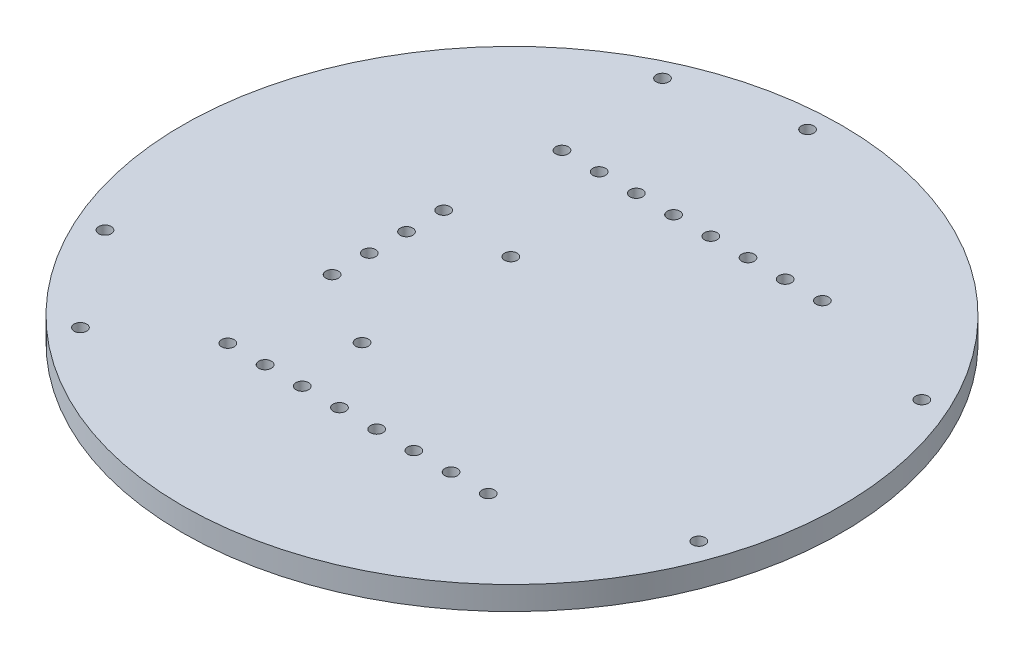
ISO-10303-21;
HEADER;
FILE_DESCRIPTION(('STEP AP214'),'2;1');
FILE_NAME('part.step','',(''),(''),'','','');
FILE_SCHEMA(('AUTOMOTIVE_DESIGN { 1 0 10303 214 1 1 1 1 }'));
ENDSEC;
DATA;
#1=APPLICATION_CONTEXT('core data for automotive mechanical design processes');
#2=APPLICATION_PROTOCOL_DEFINITION('international standard','automotive_design',2000,#1);
#3=PRODUCT_CONTEXT('',#1,'mechanical');
#4=PRODUCT('Part','Part','',(#3));
#5=PRODUCT_RELATED_PRODUCT_CATEGORY('part','',(#4));
#6=PRODUCT_DEFINITION_FORMATION('','',#4);
#7=PRODUCT_DEFINITION_CONTEXT('part definition',#1,'design');
#8=PRODUCT_DEFINITION('design','',#6,#7);
#9=PRODUCT_DEFINITION_SHAPE('','',#8);
#10=(LENGTH_UNIT() NAMED_UNIT(*) SI_UNIT(.MILLI.,.METRE.));
#11=(NAMED_UNIT(*) PLANE_ANGLE_UNIT() SI_UNIT($,.RADIAN.));
#12=(NAMED_UNIT(*) SI_UNIT($,.STERADIAN.) SOLID_ANGLE_UNIT());
#13=UNCERTAINTY_MEASURE_WITH_UNIT(LENGTH_MEASURE(1.E-05),#10,'distance_accuracy_value','');
#14=(GEOMETRIC_REPRESENTATION_CONTEXT(3) GLOBAL_UNCERTAINTY_ASSIGNED_CONTEXT((#13)) GLOBAL_UNIT_ASSIGNED_CONTEXT((#10,
#11,#12)) REPRESENTATION_CONTEXT('',''));
#15=CARTESIAN_POINT('',(0.,0.,0.));
#16=DIRECTION('',(0.,0.,1.));
#17=DIRECTION('',(1.,0.,0.));
#18=AXIS2_PLACEMENT_3D('',#15,#16,#17);
#19=CARTESIAN_POINT('',(0.,1.6,0.));
#20=DIRECTION('',(0.,-1.,0.));
#21=DIRECTION('',(0.,0.,-1.));
#22=AXIS2_PLACEMENT_3D('',#19,#20,#21);
#23=CYLINDRICAL_SURFACE('',#22,22.5);
#24=CARTESIAN_POINT('',(0.,1.6,0.));
#25=DIRECTION('',(0.,1.,0.));
#26=DIRECTION('',(0.,0.,1.));
#27=AXIS2_PLACEMENT_3D('',#24,#25,#26);
#28=CIRCLE('',#27,22.5);
#29=CARTESIAN_POINT('',(0.,1.6,22.5));
#30=VERTEX_POINT('',#29);
#31=EDGE_CURVE('E10',#30,#30,#28,.T.);
#32=ORIENTED_EDGE('',*,*,#31,.F.);
#33=EDGE_LOOP('',(#32));
#34=FACE_BOUND('',#33,.T.);
#35=CARTESIAN_POINT('',(0.,0.,0.));
#36=DIRECTION('',(0.,1.,0.));
#37=DIRECTION('',(0.,0.,1.));
#38=AXIS2_PLACEMENT_3D('',#35,#36,#37);
#39=CIRCLE('',#38,22.5);
#40=CARTESIAN_POINT('',(0.,0.,22.5));
#41=VERTEX_POINT('',#40);
#42=EDGE_CURVE('E36',#41,#41,#39,.T.);
#43=ORIENTED_EDGE('',*,*,#42,.T.);
#44=EDGE_LOOP('',(#43));
#45=FACE_BOUND('',#44,.T.);
#46=ADVANCED_FACE('F33',(#34,#45),#23,.T.);
#47=CARTESIAN_POINT('',(0.,1.6,0.));
#48=DIRECTION('',(0.,1.,0.));
#49=DIRECTION('',(0.,0.,1.));
#50=AXIS2_PLACEMENT_3D('',#47,#48,#49);
#51=PLANE('',#50);
#52=CARTESIAN_POINT('',(-2.97899464769552,1.6,-11.4699605640426));
#53=DIRECTION('',(0.,-1.,0.));
#54=DIRECTION('',(0.,0.,-1.));
#55=AXIS2_PLACEMENT_3D('',#52,#53,#54);
#56=CIRCLE('',#55,0.429187569429612);
#57=CARTESIAN_POINT('',(-2.97899464769552,1.6,-11.8991481334722));
#58=VERTEX_POINT('',#57);
#59=EDGE_CURVE('E109',#58,#58,#56,.T.);
#60=ORIENTED_EDGE('',*,*,#59,.T.);
#61=EDGE_LOOP('',(#60));
#62=FACE_BOUND('',#61,.T.);
#63=CARTESIAN_POINT('',(-5.51899464769552,1.6,-11.4699605640426));
#64=DIRECTION('',(0.,-1.,0.));
#65=DIRECTION('',(0.,0.,-1.));
#66=AXIS2_PLACEMENT_3D('',#63,#64,#65);
#67=CIRCLE('',#66,0.429187569429605);
#68=CARTESIAN_POINT('',(-5.51899464769552,1.6,-11.8991481334722));
#69=VERTEX_POINT('',#68);
#70=EDGE_CURVE('E102',#69,#69,#67,.T.);
#71=ORIENTED_EDGE('',*,*,#70,.T.);
#72=EDGE_LOOP('',(#71));
#73=FACE_BOUND('',#72,.T.);
#74=CARTESIAN_POINT('',(-8.05899464769552,1.6,-11.4699605640426));
#75=DIRECTION('',(0.,-1.,0.));
#76=DIRECTION('',(0.,0.,-1.));
#77=AXIS2_PLACEMENT_3D('',#74,#75,#76);
#78=CIRCLE('',#77,0.429187569429612);
#79=CARTESIAN_POINT('',(-8.05899464769552,1.6,-11.8991481334722));
#80=VERTEX_POINT('',#79);
#81=EDGE_CURVE('E103',#80,#80,#78,.T.);
#82=ORIENTED_EDGE('',*,*,#81,.T.);
#83=EDGE_LOOP('',(#82));
#84=FACE_BOUND('',#83,.T.);
#85=CARTESIAN_POINT('',(-3.51378517532097,1.6,6.72628011951915));
#86=DIRECTION('',(0.,-1.,0.));
#87=DIRECTION('',(0.,0.,-1.));
#88=AXIS2_PLACEMENT_3D('',#85,#86,#87);
#89=CIRCLE('',#88,0.429187569429612);
#90=CARTESIAN_POINT('',(-3.51378517532097,1.6,6.29709255008953));
#91=VERTEX_POINT('',#90);
#92=EDGE_CURVE('E116',#91,#91,#89,.T.);
#93=ORIENTED_EDGE('',*,*,#92,.T.);
#94=EDGE_LOOP('',(#93));
#95=FACE_BOUND('',#94,.T.);
#96=CARTESIAN_POINT('',(-0.438994647695517,1.6,-11.4699605640425));
#97=DIRECTION('',(0.,-1.,0.));
#98=DIRECTION('',(0.,0.,-1.));
#99=AXIS2_PLACEMENT_3D('',#96,#97,#98);
#100=CIRCLE('',#99,0.429187569429612);
#101=CARTESIAN_POINT('',(-0.438994647695517,1.6,-11.8991481334722));
#102=VERTEX_POINT('',#101);
#103=EDGE_CURVE('E127',#102,#102,#100,.T.);
#104=ORIENTED_EDGE('',*,*,#103,.T.);
#105=EDGE_LOOP('',(#104));
#106=FACE_BOUND('',#105,.T.);
#107=CARTESIAN_POINT('',(2.10100535230448,1.6,-11.4699605640425));
#108=DIRECTION('',(0.,-1.,0.));
#109=DIRECTION('',(0.,0.,-1.));
#110=AXIS2_PLACEMENT_3D('',#107,#108,#109);
#111=CIRCLE('',#110,0.429187569429612);
#112=CARTESIAN_POINT('',(2.10100535230448,1.6,-11.8991481334721));
#113=VERTEX_POINT('',#112);
#114=EDGE_CURVE('E133',#113,#113,#111,.T.);
#115=ORIENTED_EDGE('',*,*,#114,.T.);
#116=EDGE_LOOP('',(#115));
#117=FACE_BOUND('',#116,.T.);
#118=CARTESIAN_POINT('',(4.64100535230448,1.6,-11.4699605640425));
#119=DIRECTION('',(0.,-1.,0.));
#120=DIRECTION('',(0.,0.,-1.));
#121=AXIS2_PLACEMENT_3D('',#118,#119,#120);
#122=CIRCLE('',#121,0.429187569429612);
#123=CARTESIAN_POINT('',(4.64100535230448,1.6,-11.8991481334721));
#124=VERTEX_POINT('',#123);
#125=EDGE_CURVE('E139',#124,#124,#122,.T.);
#126=ORIENTED_EDGE('',*,*,#125,.T.);
#127=EDGE_LOOP('',(#126));
#128=FACE_BOUND('',#127,.T.);
#129=CARTESIAN_POINT('',(7.18100535230448,1.6,-11.4699605640425));
#130=DIRECTION('',(0.,-1.,0.));
#131=DIRECTION('',(0.,0.,-1.));
#132=AXIS2_PLACEMENT_3D('',#129,#130,#131);
#133=CIRCLE('',#132,0.429187569429605);
#134=CARTESIAN_POINT('',(7.18100535230448,1.6,-11.8991481334721));
#135=VERTEX_POINT('',#134);
#136=EDGE_CURVE('E91',#135,#135,#133,.T.);
#137=ORIENTED_EDGE('',*,*,#136,.T.);
#138=EDGE_LOOP('',(#137));
#139=FACE_BOUND('',#138,.T.);
#140=CARTESIAN_POINT('',(7.18100535230449,1.6,11.3405589401693));
#141=DIRECTION('',(0.,-1.,0.));
#142=DIRECTION('',(0.,0.,-1.));
#143=AXIS2_PLACEMENT_3D('',#140,#141,#142);
#144=CIRCLE('',#143,0.42918756942961);
#145=CARTESIAN_POINT('',(7.18100535230449,1.6,10.9113713707397));
#146=VERTEX_POINT('',#145);
#147=EDGE_CURVE('E48',#146,#146,#144,.T.);
#148=ORIENTED_EDGE('',*,*,#147,.T.);
#149=EDGE_LOOP('',(#148));
#150=FACE_BOUND('',#149,.T.);
#151=CARTESIAN_POINT('',(4.64100535230448,1.6,11.3405589401693));
#152=DIRECTION('',(0.,-1.,0.));
#153=DIRECTION('',(0.,0.,-1.));
#154=AXIS2_PLACEMENT_3D('',#151,#152,#153);
#155=CIRCLE('',#154,0.42918756942961);
#156=CARTESIAN_POINT('',(4.64100535230448,1.6,10.9113713707397));
#157=VERTEX_POINT('',#156);
#158=EDGE_CURVE('E67',#157,#157,#155,.T.);
#159=ORIENTED_EDGE('',*,*,#158,.T.);
#160=EDGE_LOOP('',(#159));
#161=FACE_BOUND('',#160,.T.);
#162=CARTESIAN_POINT('',(2.10100535230449,1.6,11.3405589401693));
#163=DIRECTION('',(0.,-1.,0.));
#164=DIRECTION('',(0.,0.,-1.));
#165=AXIS2_PLACEMENT_3D('',#162,#163,#164);
#166=CIRCLE('',#165,0.42918756942961);
#167=CARTESIAN_POINT('',(2.10100535230449,1.6,10.9113713707397));
#168=VERTEX_POINT('',#167);
#169=EDGE_CURVE('E61',#168,#168,#166,.T.);
#170=ORIENTED_EDGE('',*,*,#169,.T.);
#171=EDGE_LOOP('',(#170));
#172=FACE_BOUND('',#171,.T.);
#173=CARTESIAN_POINT('',(-0.438994647695515,1.6,11.3405589401693));
#174=DIRECTION('',(0.,-1.,0.));
#175=DIRECTION('',(0.,0.,-1.));
#176=AXIS2_PLACEMENT_3D('',#173,#174,#175);
#177=CIRCLE('',#176,0.42918756942961);
#178=CARTESIAN_POINT('',(-0.438994647695515,1.6,10.9113713707396));
#179=VERTEX_POINT('',#178);
#180=EDGE_CURVE('E54',#179,#179,#177,.T.);
#181=ORIENTED_EDGE('',*,*,#180,.T.);
#182=EDGE_LOOP('',(#181));
#183=FACE_BOUND('',#182,.T.);
#184=CARTESIAN_POINT('',(9.72100535230449,1.6,-11.4699605640425));
#185=DIRECTION('',(0.,-1.,0.));
#186=DIRECTION('',(0.,0.,-1.));
#187=AXIS2_PLACEMENT_3D('',#184,#185,#186);
#188=CIRCLE('',#187,0.429187569429612);
#189=CARTESIAN_POINT('',(9.72100535230449,1.6,-11.8991481334721));
#190=VERTEX_POINT('',#189);
#191=EDGE_CURVE('E90',#190,#190,#188,.T.);
#192=ORIENTED_EDGE('',*,*,#191,.T.);
#193=EDGE_LOOP('',(#192));
#194=FACE_BOUND('',#193,.T.);
#195=CARTESIAN_POINT('',(-8.05899464769552,1.6,11.3405589401692));
#196=DIRECTION('',(0.,-1.,0.));
#197=DIRECTION('',(0.,0.,-1.));
#198=AXIS2_PLACEMENT_3D('',#195,#196,#197);
#199=CIRCLE('',#198,0.42918756942961);
#200=CARTESIAN_POINT('',(-8.05899464769552,1.6,10.9113713707396));
#201=VERTEX_POINT('',#200);
#202=EDGE_CURVE('E79',#201,#201,#199,.T.);
#203=ORIENTED_EDGE('',*,*,#202,.T.);
#204=EDGE_LOOP('',(#203));
#205=FACE_BOUND('',#204,.T.);
#206=CARTESIAN_POINT('',(-5.51899464769551,1.6,11.3405589401692));
#207=DIRECTION('',(0.,-1.,0.));
#208=DIRECTION('',(0.,0.,-1.));
#209=AXIS2_PLACEMENT_3D('',#206,#207,#208);
#210=CIRCLE('',#209,0.42918756942961);
#211=CARTESIAN_POINT('',(-5.51899464769551,1.6,10.9113713707396));
#212=VERTEX_POINT('',#211);
#213=EDGE_CURVE('E78',#212,#212,#210,.T.);
#214=ORIENTED_EDGE('',*,*,#213,.T.);
#215=EDGE_LOOP('',(#214));
#216=FACE_BOUND('',#215,.T.);
#217=CARTESIAN_POINT('',(-2.97899464769552,1.6,11.3405589401692));
#218=DIRECTION('',(0.,-1.,0.));
#219=DIRECTION('',(0.,0.,-1.));
#220=AXIS2_PLACEMENT_3D('',#217,#218,#219);
#221=CIRCLE('',#220,0.42918756942961);
#222=CARTESIAN_POINT('',(-2.97899464769552,1.6,10.9113713707396));
#223=VERTEX_POINT('',#222);
#224=EDGE_CURVE('E55',#223,#223,#221,.T.);
#225=ORIENTED_EDGE('',*,*,#224,.T.);
#226=EDGE_LOOP('',(#225));
#227=FACE_BOUND('',#226,.T.);
#228=CARTESIAN_POINT('',(-8.88414423790684,1.6,-19.1580461894958));
#229=DIRECTION('',(0.,-1.,0.));
#230=DIRECTION('',(0.,0.,-1.));
#231=AXIS2_PLACEMENT_3D('',#228,#229,#230);
#232=CIRCLE('',#231,0.429187569429612);
#233=CARTESIAN_POINT('',(-8.88414423790684,1.6,-19.5872337589254));
#234=VERTEX_POINT('',#233);
#235=EDGE_CURVE('E192',#234,#234,#232,.T.);
#236=ORIENTED_EDGE('',*,*,#235,.T.);
#237=EDGE_LOOP('',(#236));
#238=FACE_BOUND('',#237,.T.);
#239=CARTESIAN_POINT('',(-3.51378517532097,1.6,-3.4365775709162));
#240=DIRECTION('',(0.,-1.,0.));
#241=DIRECTION('',(0.,0.,-1.));
#242=AXIS2_PLACEMENT_3D('',#239,#240,#241);
#243=CIRCLE('',#242,0.429187569429612);
#244=CARTESIAN_POINT('',(-3.51378517532097,1.6,-3.86576514034581));
#245=VERTEX_POINT('',#244);
#246=EDGE_CURVE('E198',#245,#245,#243,.T.);
#247=ORIENTED_EDGE('',*,*,#246,.T.);
#248=EDGE_LOOP('',(#247));
#249=FACE_BOUND('',#248,.T.);
#250=CARTESIAN_POINT('',(-18.9407008940795,1.6,8.84754938333288));
#251=DIRECTION('',(0.,-1.,0.));
#252=DIRECTION('',(0.,0.,-1.));
#253=AXIS2_PLACEMENT_3D('',#250,#251,#252);
#254=CIRCLE('',#253,0.429187569429612);
#255=CARTESIAN_POINT('',(-18.9407008940795,1.6,8.41836181390326));
#256=VERTEX_POINT('',#255);
#257=EDGE_CURVE('E204',#256,#256,#254,.T.);
#258=ORIENTED_EDGE('',*,*,#257,.T.);
#259=EDGE_LOOP('',(#258));
#260=FACE_BOUND('',#259,.T.);
#261=CARTESIAN_POINT('',(-14.0138656520684,1.6,15.4510772660608));
#262=DIRECTION('',(0.,-1.,0.));
#263=DIRECTION('',(0.,0.,-1.));
#264=AXIS2_PLACEMENT_3D('',#261,#262,#263);
#265=CIRCLE('',#264,0.429187569429612);
#266=CARTESIAN_POINT('',(-14.0138656520684,1.6,15.0218896966312));
#267=VERTEX_POINT('',#266);
#268=EDGE_CURVE('E170',#267,#267,#265,.T.);
#269=ORIENTED_EDGE('',*,*,#268,.T.);
#270=EDGE_LOOP('',(#269));
#271=FACE_BOUND('',#270,.T.);
#272=CARTESIAN_POINT('',(-8.55485081393295,1.6,-3.89168443572245));
#273=DIRECTION('',(0.,-1.,0.));
#274=DIRECTION('',(0.,0.,-1.));
#275=AXIS2_PLACEMENT_3D('',#272,#273,#274);
#276=CIRCLE('',#275,0.429187569429612);
#277=CARTESIAN_POINT('',(-8.55485081393295,1.6,-4.32087200515206));
#278=VERTEX_POINT('',#277);
#279=EDGE_CURVE('E169',#278,#278,#276,.T.);
#280=ORIENTED_EDGE('',*,*,#279,.T.);
#281=EDGE_LOOP('',(#280));
#282=FACE_BOUND('',#281,.T.);
#283=CARTESIAN_POINT('',(-8.55485081393298,1.6,-1.35168443572245));
#284=DIRECTION('',(0.,-1.,0.));
#285=DIRECTION('',(0.,0.,-1.));
#286=AXIS2_PLACEMENT_3D('',#283,#284,#285);
#287=CIRCLE('',#286,0.429187569429612);
#288=CARTESIAN_POINT('',(-8.55485081393298,1.6,-1.78087200515206));
#289=VERTEX_POINT('',#288);
#290=EDGE_CURVE('E176',#289,#289,#287,.T.);
#291=ORIENTED_EDGE('',*,*,#290,.T.);
#292=EDGE_LOOP('',(#291));
#293=FACE_BOUND('',#292,.T.);
#294=CARTESIAN_POINT('',(-8.55485081393301,1.6,1.18831556427755));
#295=DIRECTION('',(0.,-1.,0.));
#296=DIRECTION('',(0.,0.,-1.));
#297=AXIS2_PLACEMENT_3D('',#294,#295,#296);
#298=CIRCLE('',#297,0.429187569429612);
#299=CARTESIAN_POINT('',(-8.55485081393301,1.6,0.759127994847939));
#300=VERTEX_POINT('',#299);
#301=EDGE_CURVE('E182',#300,#300,#298,.T.);
#302=ORIENTED_EDGE('',*,*,#301,.T.);
#303=EDGE_LOOP('',(#302));
#304=FACE_BOUND('',#303,.T.);
#305=CARTESIAN_POINT('',(-8.55485081393303,1.6,3.72831556427755));
#306=DIRECTION('',(0.,-1.,0.));
#307=DIRECTION('',(0.,0.,-1.));
#308=AXIS2_PLACEMENT_3D('',#305,#306,#307);
#309=CIRCLE('',#308,0.429187569429612);
#310=CARTESIAN_POINT('',(-8.55485081393303,1.6,3.29912799484794));
#311=VERTEX_POINT('',#310);
#312=EDGE_CURVE('E117',#311,#311,#309,.T.);
#313=ORIENTED_EDGE('',*,*,#312,.T.);
#314=EDGE_LOOP('',(#313));
#315=FACE_BOUND('',#314,.T.);
#316=CARTESIAN_POINT('',(18.9717831853835,1.6,-9.00947234491412));
#317=DIRECTION('',(0.,-1.,0.));
#318=DIRECTION('',(0.,0.,-1.));
#319=AXIS2_PLACEMENT_3D('',#316,#317,#318);
#320=CIRCLE('',#319,0.429187569429612);
#321=CARTESIAN_POINT('',(18.9717831853835,1.6,-9.43865991434373));
#322=VERTEX_POINT('',#321);
#323=EDGE_CURVE('E151',#322,#322,#320,.T.);
#324=ORIENTED_EDGE('',*,*,#323,.T.);
#325=EDGE_LOOP('',(#324));
#326=FACE_BOUND('',#325,.T.);
#327=CARTESIAN_POINT('',(19.7228158943386,1.6,6.97046417118941));
#328=DIRECTION('',(0.,-1.,0.));
#329=DIRECTION('',(0.,0.,-1.));
#330=AXIS2_PLACEMENT_3D('',#327,#328,#329);
#331=CIRCLE('',#330,0.429187569429612);
#332=CARTESIAN_POINT('',(19.7228158943386,1.6,6.54127660175979));
#333=VERTEX_POINT('',#332);
#334=EDGE_CURVE('E150',#333,#333,#331,.T.);
#335=ORIENTED_EDGE('',*,*,#334,.T.);
#336=EDGE_LOOP('',(#335));
#337=FACE_BOUND('',#336,.T.);
#338=CARTESIAN_POINT('',(-0.906931183922655,1.6,-21.088850712065));
#339=DIRECTION('',(0.,-1.,0.));
#340=DIRECTION('',(0.,0.,-1.));
#341=AXIS2_PLACEMENT_3D('',#338,#339,#340);
#342=CIRCLE('',#341,0.429187569429612);
#343=CARTESIAN_POINT('',(-0.906931183922655,1.6,-21.5180382814946));
#344=VERTEX_POINT('',#343);
#345=EDGE_CURVE('E157',#344,#344,#342,.T.);
#346=ORIENTED_EDGE('',*,*,#345,.T.);
#347=EDGE_LOOP('',(#346));
#348=FACE_BOUND('',#347,.T.);
#349=CARTESIAN_POINT('',(9.72100535230449,1.6,11.3405589401693));
#350=DIRECTION('',(0.,-1.,0.));
#351=DIRECTION('',(0.,0.,-1.));
#352=AXIS2_PLACEMENT_3D('',#349,#350,#351);
#353=CIRCLE('',#352,0.42918756942961);
#354=CARTESIAN_POINT('',(9.72100535230449,1.6,10.9113713707397));
#355=VERTEX_POINT('',#354);
#356=EDGE_CURVE('E43',#355,#355,#353,.T.);
#357=ORIENTED_EDGE('',*,*,#356,.T.);
#358=EDGE_LOOP('',(#357));
#359=FACE_BOUND('',#358,.T.);
#360=ORIENTED_EDGE('',*,*,#31,.T.);
#361=EDGE_LOOP('',(#360));
#362=FACE_BOUND('',#361,.T.);
#363=ADVANCED_FACE('F213',(#62,#73,#84,#95,#106,#117,#128,#139,#150,#161,#172,#183,#194,#205,
#216,#227,#238,#249,#260,#271,#282,#293,#304,#315,#326,#337,#348,#359,#362),#51,.T.);
#364=CARTESIAN_POINT('',(0.,0.,0.));
#365=DIRECTION('',(0.,1.,0.));
#366=DIRECTION('',(0.,0.,1.));
#367=AXIS2_PLACEMENT_3D('',#364,#365,#366);
#368=PLANE('',#367);
#369=CARTESIAN_POINT('',(-2.97899464769552,0.,-11.4699605640426));
#370=DIRECTION('',(0.,-1.,0.));
#371=DIRECTION('',(0.,0.,-1.));
#372=AXIS2_PLACEMENT_3D('',#369,#370,#371);
#373=CIRCLE('',#372,0.429187569429612);
#374=CARTESIAN_POINT('',(-2.97899464769552,0.,-11.8991481334722));
#375=VERTEX_POINT('',#374);
#376=EDGE_CURVE('E106',#375,#375,#373,.T.);
#377=ORIENTED_EDGE('',*,*,#376,.F.);
#378=EDGE_LOOP('',(#377));
#379=FACE_BOUND('',#378,.T.);
#380=CARTESIAN_POINT('',(-5.51899464769552,0.,-11.4699605640426));
#381=DIRECTION('',(0.,-1.,0.));
#382=DIRECTION('',(0.,0.,-1.));
#383=AXIS2_PLACEMENT_3D('',#380,#381,#382);
#384=CIRCLE('',#383,0.429187569429605);
#385=CARTESIAN_POINT('',(-5.51899464769552,0.,-11.8991481334722));
#386=VERTEX_POINT('',#385);
#387=EDGE_CURVE('E99',#386,#386,#384,.T.);
#388=ORIENTED_EDGE('',*,*,#387,.F.);
#389=EDGE_LOOP('',(#388));
#390=FACE_BOUND('',#389,.T.);
#391=CARTESIAN_POINT('',(-8.05899464769552,0.,-11.4699605640426));
#392=DIRECTION('',(0.,-1.,0.));
#393=DIRECTION('',(0.,0.,-1.));
#394=AXIS2_PLACEMENT_3D('',#391,#392,#393);
#395=CIRCLE('',#394,0.429187569429612);
#396=CARTESIAN_POINT('',(-8.05899464769552,0.,-11.8991481334722));
#397=VERTEX_POINT('',#396);
#398=EDGE_CURVE('E120',#397,#397,#395,.T.);
#399=ORIENTED_EDGE('',*,*,#398,.F.);
#400=EDGE_LOOP('',(#399));
#401=FACE_BOUND('',#400,.T.);
#402=CARTESIAN_POINT('',(-3.51378517532097,0.,6.72628011951915));
#403=DIRECTION('',(0.,-1.,0.));
#404=DIRECTION('',(0.,0.,-1.));
#405=AXIS2_PLACEMENT_3D('',#402,#403,#404);
#406=CIRCLE('',#405,0.429187569429612);
#407=CARTESIAN_POINT('',(-3.51378517532097,0.,6.29709255008953));
#408=VERTEX_POINT('',#407);
#409=EDGE_CURVE('E113',#408,#408,#406,.T.);
#410=ORIENTED_EDGE('',*,*,#409,.F.);
#411=EDGE_LOOP('',(#410));
#412=FACE_BOUND('',#411,.T.);
#413=CARTESIAN_POINT('',(-0.438994647695517,0.,-11.4699605640425));
#414=DIRECTION('',(0.,-1.,0.));
#415=DIRECTION('',(0.,0.,-1.));
#416=AXIS2_PLACEMENT_3D('',#413,#414,#415);
#417=CIRCLE('',#416,0.429187569429612);
#418=CARTESIAN_POINT('',(-0.438994647695517,0.,-11.8991481334722));
#419=VERTEX_POINT('',#418);
#420=EDGE_CURVE('E112',#419,#419,#417,.T.);
#421=ORIENTED_EDGE('',*,*,#420,.F.);
#422=EDGE_LOOP('',(#421));
#423=FACE_BOUND('',#422,.T.);
#424=CARTESIAN_POINT('',(2.10100535230448,0.,-11.4699605640425));
#425=DIRECTION('',(0.,-1.,0.));
#426=DIRECTION('',(0.,0.,-1.));
#427=AXIS2_PLACEMENT_3D('',#424,#425,#426);
#428=CIRCLE('',#427,0.429187569429612);
#429=CARTESIAN_POINT('',(2.10100535230448,0.,-11.8991481334721));
#430=VERTEX_POINT('',#429);
#431=EDGE_CURVE('E130',#430,#430,#428,.T.);
#432=ORIENTED_EDGE('',*,*,#431,.F.);
#433=EDGE_LOOP('',(#432));
#434=FACE_BOUND('',#433,.T.);
#435=CARTESIAN_POINT('',(4.64100535230448,0.,-11.4699605640425));
#436=DIRECTION('',(0.,-1.,0.));
#437=DIRECTION('',(0.,0.,-1.));
#438=AXIS2_PLACEMENT_3D('',#435,#436,#437);
#439=CIRCLE('',#438,0.429187569429612);
#440=CARTESIAN_POINT('',(4.64100535230448,0.,-11.8991481334721));
#441=VERTEX_POINT('',#440);
#442=EDGE_CURVE('E136',#441,#441,#439,.T.);
#443=ORIENTED_EDGE('',*,*,#442,.F.);
#444=EDGE_LOOP('',(#443));
#445=FACE_BOUND('',#444,.T.);
#446=CARTESIAN_POINT('',(7.18100535230448,0.,-11.4699605640425));
#447=DIRECTION('',(0.,-1.,0.));
#448=DIRECTION('',(0.,0.,-1.));
#449=AXIS2_PLACEMENT_3D('',#446,#447,#448);
#450=CIRCLE('',#449,0.429187569429605);
#451=CARTESIAN_POINT('',(7.18100535230448,0.,-11.8991481334721));
#452=VERTEX_POINT('',#451);
#453=EDGE_CURVE('E142',#452,#452,#450,.T.);
#454=ORIENTED_EDGE('',*,*,#453,.F.);
#455=EDGE_LOOP('',(#454));
#456=FACE_BOUND('',#455,.T.);
#457=CARTESIAN_POINT('',(7.18100535230449,0.,11.3405589401693));
#458=DIRECTION('',(0.,-1.,0.));
#459=DIRECTION('',(0.,0.,-1.));
#460=AXIS2_PLACEMENT_3D('',#457,#458,#459);
#461=CIRCLE('',#460,0.42918756942961);
#462=CARTESIAN_POINT('',(7.18100535230449,0.,10.9113713707397));
#463=VERTEX_POINT('',#462);
#464=EDGE_CURVE('E70',#463,#463,#461,.T.);
#465=ORIENTED_EDGE('',*,*,#464,.F.);
#466=EDGE_LOOP('',(#465));
#467=FACE_BOUND('',#466,.T.);
#468=CARTESIAN_POINT('',(4.64100535230448,0.,11.3405589401693));
#469=DIRECTION('',(0.,-1.,0.));
#470=DIRECTION('',(0.,0.,-1.));
#471=AXIS2_PLACEMENT_3D('',#468,#469,#470);
#472=CIRCLE('',#471,0.42918756942961);
#473=CARTESIAN_POINT('',(4.64100535230448,0.,10.9113713707397));
#474=VERTEX_POINT('',#473);
#475=EDGE_CURVE('E64',#474,#474,#472,.T.);
#476=ORIENTED_EDGE('',*,*,#475,.F.);
#477=EDGE_LOOP('',(#476));
#478=FACE_BOUND('',#477,.T.);
#479=CARTESIAN_POINT('',(2.10100535230449,0.,11.3405589401693));
#480=DIRECTION('',(0.,-1.,0.));
#481=DIRECTION('',(0.,0.,-1.));
#482=AXIS2_PLACEMENT_3D('',#479,#480,#481);
#483=CIRCLE('',#482,0.42918756942961);
#484=CARTESIAN_POINT('',(2.10100535230449,0.,10.9113713707397));
#485=VERTEX_POINT('',#484);
#486=EDGE_CURVE('E58',#485,#485,#483,.T.);
#487=ORIENTED_EDGE('',*,*,#486,.F.);
#488=EDGE_LOOP('',(#487));
#489=FACE_BOUND('',#488,.T.);
#490=CARTESIAN_POINT('',(-0.438994647695515,0.,11.3405589401693));
#491=DIRECTION('',(0.,-1.,0.));
#492=DIRECTION('',(0.,0.,-1.));
#493=AXIS2_PLACEMENT_3D('',#490,#491,#492);
#494=CIRCLE('',#493,0.42918756942961);
#495=CARTESIAN_POINT('',(-0.438994647695515,0.,10.9113713707396));
#496=VERTEX_POINT('',#495);
#497=EDGE_CURVE('E51',#496,#496,#494,.T.);
#498=ORIENTED_EDGE('',*,*,#497,.F.);
#499=EDGE_LOOP('',(#498));
#500=FACE_BOUND('',#499,.T.);
#501=CARTESIAN_POINT('',(9.72100535230449,0.,-11.4699605640425));
#502=DIRECTION('',(0.,-1.,0.));
#503=DIRECTION('',(0.,0.,-1.));
#504=AXIS2_PLACEMENT_3D('',#501,#502,#503);
#505=CIRCLE('',#504,0.429187569429612);
#506=CARTESIAN_POINT('',(9.72100535230449,0.,-11.8991481334721));
#507=VERTEX_POINT('',#506);
#508=EDGE_CURVE('E87',#507,#507,#505,.T.);
#509=ORIENTED_EDGE('',*,*,#508,.F.);
#510=EDGE_LOOP('',(#509));
#511=FACE_BOUND('',#510,.T.);
#512=CARTESIAN_POINT('',(-8.05899464769552,0.,11.3405589401692));
#513=DIRECTION('',(0.,-1.,0.));
#514=DIRECTION('',(0.,0.,-1.));
#515=AXIS2_PLACEMENT_3D('',#512,#513,#514);
#516=CIRCLE('',#515,0.42918756942961);
#517=CARTESIAN_POINT('',(-8.05899464769552,0.,10.9113713707396));
#518=VERTEX_POINT('',#517);
#519=EDGE_CURVE('E94',#518,#518,#516,.T.);
#520=ORIENTED_EDGE('',*,*,#519,.F.);
#521=EDGE_LOOP('',(#520));
#522=FACE_BOUND('',#521,.T.);
#523=CARTESIAN_POINT('',(-5.51899464769551,0.,11.3405589401692));
#524=DIRECTION('',(0.,-1.,0.));
#525=DIRECTION('',(0.,0.,-1.));
#526=AXIS2_PLACEMENT_3D('',#523,#524,#525);
#527=CIRCLE('',#526,0.42918756942961);
#528=CARTESIAN_POINT('',(-5.51899464769551,0.,10.9113713707396));
#529=VERTEX_POINT('',#528);
#530=EDGE_CURVE('E75',#529,#529,#527,.T.);
#531=ORIENTED_EDGE('',*,*,#530,.F.);
#532=EDGE_LOOP('',(#531));
#533=FACE_BOUND('',#532,.T.);
#534=CARTESIAN_POINT('',(-2.97899464769552,0.,11.3405589401692));
#535=DIRECTION('',(0.,-1.,0.));
#536=DIRECTION('',(0.,0.,-1.));
#537=AXIS2_PLACEMENT_3D('',#534,#535,#536);
#538=CIRCLE('',#537,0.42918756942961);
#539=CARTESIAN_POINT('',(-2.97899464769552,0.,10.9113713707396));
#540=VERTEX_POINT('',#539);
#541=EDGE_CURVE('E82',#540,#540,#538,.T.);
#542=ORIENTED_EDGE('',*,*,#541,.F.);
#543=EDGE_LOOP('',(#542));
#544=FACE_BOUND('',#543,.T.);
#545=CARTESIAN_POINT('',(-8.88414423790684,0.,-19.1580461894958));
#546=DIRECTION('',(0.,-1.,0.));
#547=DIRECTION('',(0.,0.,-1.));
#548=AXIS2_PLACEMENT_3D('',#545,#546,#547);
#549=CIRCLE('',#548,0.429187569429612);
#550=CARTESIAN_POINT('',(-8.88414423790684,0.,-19.5872337589254));
#551=VERTEX_POINT('',#550);
#552=EDGE_CURVE('E160',#551,#551,#549,.T.);
#553=ORIENTED_EDGE('',*,*,#552,.F.);
#554=EDGE_LOOP('',(#553));
#555=FACE_BOUND('',#554,.T.);
#556=CARTESIAN_POINT('',(-3.51378517532097,0.,-3.4365775709162));
#557=DIRECTION('',(0.,-1.,0.));
#558=DIRECTION('',(0.,0.,-1.));
#559=AXIS2_PLACEMENT_3D('',#556,#557,#558);
#560=CIRCLE('',#559,0.429187569429612);
#561=CARTESIAN_POINT('',(-3.51378517532097,0.,-3.86576514034581));
#562=VERTEX_POINT('',#561);
#563=EDGE_CURVE('E195',#562,#562,#560,.T.);
#564=ORIENTED_EDGE('',*,*,#563,.F.);
#565=EDGE_LOOP('',(#564));
#566=FACE_BOUND('',#565,.T.);
#567=CARTESIAN_POINT('',(-18.9407008940795,0.,8.84754938333288));
#568=DIRECTION('',(0.,-1.,0.));
#569=DIRECTION('',(0.,0.,-1.));
#570=AXIS2_PLACEMENT_3D('',#567,#568,#569);
#571=CIRCLE('',#570,0.429187569429612);
#572=CARTESIAN_POINT('',(-18.9407008940795,0.,8.41836181390326));
#573=VERTEX_POINT('',#572);
#574=EDGE_CURVE('E201',#573,#573,#571,.T.);
#575=ORIENTED_EDGE('',*,*,#574,.F.);
#576=EDGE_LOOP('',(#575));
#577=FACE_BOUND('',#576,.T.);
#578=CARTESIAN_POINT('',(-14.0138656520684,0.,15.4510772660608));
#579=DIRECTION('',(0.,-1.,0.));
#580=DIRECTION('',(0.,0.,-1.));
#581=AXIS2_PLACEMENT_3D('',#578,#579,#580);
#582=CIRCLE('',#581,0.429187569429612);
#583=CARTESIAN_POINT('',(-14.0138656520684,0.,15.0218896966312));
#584=VERTEX_POINT('',#583);
#585=EDGE_CURVE('E207',#584,#584,#582,.T.);
#586=ORIENTED_EDGE('',*,*,#585,.F.);
#587=EDGE_LOOP('',(#586));
#588=FACE_BOUND('',#587,.T.);
#589=CARTESIAN_POINT('',(-8.55485081393295,0.,-3.89168443572245));
#590=DIRECTION('',(0.,-1.,0.));
#591=DIRECTION('',(0.,0.,-1.));
#592=AXIS2_PLACEMENT_3D('',#589,#590,#591);
#593=CIRCLE('',#592,0.429187569429612);
#594=CARTESIAN_POINT('',(-8.55485081393295,0.,-4.32087200515206));
#595=VERTEX_POINT('',#594);
#596=EDGE_CURVE('E166',#595,#595,#593,.T.);
#597=ORIENTED_EDGE('',*,*,#596,.F.);
#598=EDGE_LOOP('',(#597));
#599=FACE_BOUND('',#598,.T.);
#600=CARTESIAN_POINT('',(-8.55485081393298,0.,-1.35168443572245));
#601=DIRECTION('',(0.,-1.,0.));
#602=DIRECTION('',(0.,0.,-1.));
#603=AXIS2_PLACEMENT_3D('',#600,#601,#602);
#604=CIRCLE('',#603,0.429187569429612);
#605=CARTESIAN_POINT('',(-8.55485081393298,0.,-1.78087200515206));
#606=VERTEX_POINT('',#605);
#607=EDGE_CURVE('E173',#606,#606,#604,.T.);
#608=ORIENTED_EDGE('',*,*,#607,.F.);
#609=EDGE_LOOP('',(#608));
#610=FACE_BOUND('',#609,.T.);
#611=CARTESIAN_POINT('',(-8.55485081393301,0.,1.18831556427755));
#612=DIRECTION('',(0.,-1.,0.));
#613=DIRECTION('',(0.,0.,-1.));
#614=AXIS2_PLACEMENT_3D('',#611,#612,#613);
#615=CIRCLE('',#614,0.429187569429612);
#616=CARTESIAN_POINT('',(-8.55485081393301,0.,0.759127994847939));
#617=VERTEX_POINT('',#616);
#618=EDGE_CURVE('E179',#617,#617,#615,.T.);
#619=ORIENTED_EDGE('',*,*,#618,.F.);
#620=EDGE_LOOP('',(#619));
#621=FACE_BOUND('',#620,.T.);
#622=CARTESIAN_POINT('',(-8.55485081393303,0.,3.72831556427755));
#623=DIRECTION('',(0.,-1.,0.));
#624=DIRECTION('',(0.,0.,-1.));
#625=AXIS2_PLACEMENT_3D('',#622,#623,#624);
#626=CIRCLE('',#625,0.429187569429612);
#627=CARTESIAN_POINT('',(-8.55485081393303,0.,3.29912799484794));
#628=VERTEX_POINT('',#627);
#629=EDGE_CURVE('E185',#628,#628,#626,.T.);
#630=ORIENTED_EDGE('',*,*,#629,.F.);
#631=EDGE_LOOP('',(#630));
#632=FACE_BOUND('',#631,.T.);
#633=CARTESIAN_POINT('',(18.9717831853835,0.,-9.00947234491412));
#634=DIRECTION('',(0.,-1.,0.));
#635=DIRECTION('',(0.,0.,-1.));
#636=AXIS2_PLACEMENT_3D('',#633,#634,#635);
#637=CIRCLE('',#636,0.429187569429612);
#638=CARTESIAN_POINT('',(18.9717831853835,0.,-9.43865991434373));
#639=VERTEX_POINT('',#638);
#640=EDGE_CURVE('E161',#639,#639,#637,.T.);
#641=ORIENTED_EDGE('',*,*,#640,.F.);
#642=EDGE_LOOP('',(#641));
#643=FACE_BOUND('',#642,.T.);
#644=CARTESIAN_POINT('',(19.7228158943386,0.,6.97046417118941));
#645=DIRECTION('',(0.,-1.,0.));
#646=DIRECTION('',(0.,0.,-1.));
#647=AXIS2_PLACEMENT_3D('',#644,#645,#646);
#648=CIRCLE('',#647,0.429187569429612);
#649=CARTESIAN_POINT('',(19.7228158943386,0.,6.54127660175979));
#650=VERTEX_POINT('',#649);
#651=EDGE_CURVE('E147',#650,#650,#648,.T.);
#652=ORIENTED_EDGE('',*,*,#651,.F.);
#653=EDGE_LOOP('',(#652));
#654=FACE_BOUND('',#653,.T.);
#655=CARTESIAN_POINT('',(-0.906931183922655,0.,-21.088850712065));
#656=DIRECTION('',(0.,-1.,0.));
#657=DIRECTION('',(0.,0.,-1.));
#658=AXIS2_PLACEMENT_3D('',#655,#656,#657);
#659=CIRCLE('',#658,0.429187569429612);
#660=CARTESIAN_POINT('',(-0.906931183922655,0.,-21.5180382814946));
#661=VERTEX_POINT('',#660);
#662=EDGE_CURVE('E154',#661,#661,#659,.T.);
#663=ORIENTED_EDGE('',*,*,#662,.F.);
#664=EDGE_LOOP('',(#663));
#665=FACE_BOUND('',#664,.T.);
#666=CARTESIAN_POINT('',(9.72100535230449,0.,11.3405589401693));
#667=DIRECTION('',(0.,-1.,0.));
#668=DIRECTION('',(0.,0.,-1.));
#669=AXIS2_PLACEMENT_3D('',#666,#667,#668);
#670=CIRCLE('',#669,0.42918756942961);
#671=CARTESIAN_POINT('',(9.72100535230449,0.,10.9113713707397));
#672=VERTEX_POINT('',#671);
#673=EDGE_CURVE('E45',#672,#672,#670,.T.);
#674=ORIENTED_EDGE('',*,*,#673,.F.);
#675=EDGE_LOOP('',(#674));
#676=FACE_BOUND('',#675,.T.);
#677=ORIENTED_EDGE('',*,*,#42,.F.);
#678=EDGE_LOOP('',(#677));
#679=FACE_BOUND('',#678,.T.);
#680=ADVANCED_FACE('F224',(#379,#390,#401,#412,#423,#434,#445,#456,#467,#478,#489,#500,#511,
#522,#533,#544,#555,#566,#577,#588,#599,#610,#621,#632,#643,#654,#665,#676,#679),#368,.F.);
#681=CARTESIAN_POINT('',(9.72100535230449,1.6,11.3405589401693));
#682=DIRECTION('',(0.,-1.,0.));
#683=DIRECTION('',(0.,0.,-1.));
#684=AXIS2_PLACEMENT_3D('',#681,#682,#683);
#685=CYLINDRICAL_SURFACE('',#684,0.42918756942961);
#686=ORIENTED_EDGE('',*,*,#356,.F.);
#687=EDGE_LOOP('',(#686));
#688=FACE_BOUND('',#687,.T.);
#689=ORIENTED_EDGE('',*,*,#673,.T.);
#690=EDGE_LOOP('',(#689));
#691=FACE_BOUND('',#690,.T.);
#692=ADVANCED_FACE('F227',(#688,#691),#685,.F.);
#693=CARTESIAN_POINT('',(-0.906931183922655,1.6,-21.088850712065));
#694=DIRECTION('',(0.,-1.,0.));
#695=DIRECTION('',(0.,0.,-1.));
#696=AXIS2_PLACEMENT_3D('',#693,#694,#695);
#697=CYLINDRICAL_SURFACE('',#696,0.429187569429612);
#698=ORIENTED_EDGE('',*,*,#345,.F.);
#699=EDGE_LOOP('',(#698));
#700=FACE_BOUND('',#699,.T.);
#701=ORIENTED_EDGE('',*,*,#662,.T.);
#702=EDGE_LOOP('',(#701));
#703=FACE_BOUND('',#702,.T.);
#704=ADVANCED_FACE('F260',(#700,#703),#697,.F.);
#705=CARTESIAN_POINT('',(19.7228158943386,1.6,6.97046417118941));
#706=DIRECTION('',(0.,-1.,0.));
#707=DIRECTION('',(0.,0.,-1.));
#708=AXIS2_PLACEMENT_3D('',#705,#706,#707);
#709=CYLINDRICAL_SURFACE('',#708,0.429187569429612);
#710=ORIENTED_EDGE('',*,*,#334,.F.);
#711=EDGE_LOOP('',(#710));
#712=FACE_BOUND('',#711,.T.);
#713=ORIENTED_EDGE('',*,*,#651,.T.);
#714=EDGE_LOOP('',(#713));
#715=FACE_BOUND('',#714,.T.);
#716=ADVANCED_FACE('F327',(#712,#715),#709,.F.);
#717=CARTESIAN_POINT('',(18.9717831853835,1.6,-9.00947234491412));
#718=DIRECTION('',(0.,-1.,0.));
#719=DIRECTION('',(0.,0.,-1.));
#720=AXIS2_PLACEMENT_3D('',#717,#718,#719);
#721=CYLINDRICAL_SURFACE('',#720,0.429187569429612);
#722=ORIENTED_EDGE('',*,*,#323,.F.);
#723=EDGE_LOOP('',(#722));
#724=FACE_BOUND('',#723,.T.);
#725=ORIENTED_EDGE('',*,*,#640,.T.);
#726=EDGE_LOOP('',(#725));
#727=FACE_BOUND('',#726,.T.);
#728=ADVANCED_FACE('F330',(#724,#727),#721,.F.);
#729=CARTESIAN_POINT('',(-8.55485081393303,1.6,3.72831556427755));
#730=DIRECTION('',(0.,-1.,0.));
#731=DIRECTION('',(0.,0.,-1.));
#732=AXIS2_PLACEMENT_3D('',#729,#730,#731);
#733=CYLINDRICAL_SURFACE('',#732,0.429187569429612);
#734=ORIENTED_EDGE('',*,*,#312,.F.);
#735=EDGE_LOOP('',(#734));
#736=FACE_BOUND('',#735,.T.);
#737=ORIENTED_EDGE('',*,*,#629,.T.);
#738=EDGE_LOOP('',(#737));
#739=FACE_BOUND('',#738,.T.);
#740=ADVANCED_FACE('F337',(#736,#739),#733,.F.);
#741=CARTESIAN_POINT('',(-8.55485081393301,1.6,1.18831556427755));
#742=DIRECTION('',(0.,-1.,0.));
#743=DIRECTION('',(0.,0.,-1.));
#744=AXIS2_PLACEMENT_3D('',#741,#742,#743);
#745=CYLINDRICAL_SURFACE('',#744,0.429187569429612);
#746=ORIENTED_EDGE('',*,*,#301,.F.);
#747=EDGE_LOOP('',(#746));
#748=FACE_BOUND('',#747,.T.);
#749=ORIENTED_EDGE('',*,*,#618,.T.);
#750=EDGE_LOOP('',(#749));
#751=FACE_BOUND('',#750,.T.);
#752=ADVANCED_FACE('F345',(#748,#751),#745,.F.);
#753=CARTESIAN_POINT('',(-8.55485081393298,1.6,-1.35168443572245));
#754=DIRECTION('',(0.,-1.,0.));
#755=DIRECTION('',(0.,0.,-1.));
#756=AXIS2_PLACEMENT_3D('',#753,#754,#755);
#757=CYLINDRICAL_SURFACE('',#756,0.429187569429612);
#758=ORIENTED_EDGE('',*,*,#290,.F.);
#759=EDGE_LOOP('',(#758));
#760=FACE_BOUND('',#759,.T.);
#761=ORIENTED_EDGE('',*,*,#607,.T.);
#762=EDGE_LOOP('',(#761));
#763=FACE_BOUND('',#762,.T.);
#764=ADVANCED_FACE('F341',(#760,#763),#757,.F.);
#765=CARTESIAN_POINT('',(-8.55485081393295,1.6,-3.89168443572245));
#766=DIRECTION('',(0.,-1.,0.));
#767=DIRECTION('',(0.,0.,-1.));
#768=AXIS2_PLACEMENT_3D('',#765,#766,#767);
#769=CYLINDRICAL_SURFACE('',#768,0.429187569429612);
#770=ORIENTED_EDGE('',*,*,#279,.F.);
#771=EDGE_LOOP('',(#770));
#772=FACE_BOUND('',#771,.T.);
#773=ORIENTED_EDGE('',*,*,#596,.T.);
#774=EDGE_LOOP('',(#773));
#775=FACE_BOUND('',#774,.T.);
#776=ADVANCED_FACE('F220',(#772,#775),#769,.F.);
#777=CARTESIAN_POINT('',(-14.0138656520684,1.6,15.4510772660608));
#778=DIRECTION('',(0.,-1.,0.));
#779=DIRECTION('',(0.,0.,-1.));
#780=AXIS2_PLACEMENT_3D('',#777,#778,#779);
#781=CYLINDRICAL_SURFACE('',#780,0.429187569429612);
#782=ORIENTED_EDGE('',*,*,#268,.F.);
#783=EDGE_LOOP('',(#782));
#784=FACE_BOUND('',#783,.T.);
#785=ORIENTED_EDGE('',*,*,#585,.T.);
#786=EDGE_LOOP('',(#785));
#787=FACE_BOUND('',#786,.T.);
#788=ADVANCED_FACE('F216',(#784,#787),#781,.F.);
#789=CARTESIAN_POINT('',(-18.9407008940795,1.6,8.84754938333288));
#790=DIRECTION('',(0.,-1.,0.));
#791=DIRECTION('',(0.,0.,-1.));
#792=AXIS2_PLACEMENT_3D('',#789,#790,#791);
#793=CYLINDRICAL_SURFACE('',#792,0.429187569429612);
#794=ORIENTED_EDGE('',*,*,#257,.F.);
#795=EDGE_LOOP('',(#794));
#796=FACE_BOUND('',#795,.T.);
#797=ORIENTED_EDGE('',*,*,#574,.T.);
#798=EDGE_LOOP('',(#797));
#799=FACE_BOUND('',#798,.T.);
#800=ADVANCED_FACE('F219',(#796,#799),#793,.F.);
#801=CARTESIAN_POINT('',(-3.51378517532097,1.6,-3.4365775709162));
#802=DIRECTION('',(0.,-1.,0.));
#803=DIRECTION('',(0.,0.,-1.));
#804=AXIS2_PLACEMENT_3D('',#801,#802,#803);
#805=CYLINDRICAL_SURFACE('',#804,0.429187569429612);
#806=ORIENTED_EDGE('',*,*,#246,.F.);
#807=EDGE_LOOP('',(#806));
#808=FACE_BOUND('',#807,.T.);
#809=ORIENTED_EDGE('',*,*,#563,.T.);
#810=EDGE_LOOP('',(#809));
#811=FACE_BOUND('',#810,.T.);
#812=ADVANCED_FACE('F355',(#808,#811),#805,.F.);
#813=CARTESIAN_POINT('',(-8.88414423790684,1.6,-19.1580461894958));
#814=DIRECTION('',(0.,-1.,0.));
#815=DIRECTION('',(0.,0.,-1.));
#816=AXIS2_PLACEMENT_3D('',#813,#814,#815);
#817=CYLINDRICAL_SURFACE('',#816,0.429187569429612);
#818=ORIENTED_EDGE('',*,*,#235,.F.);
#819=EDGE_LOOP('',(#818));
#820=FACE_BOUND('',#819,.T.);
#821=ORIENTED_EDGE('',*,*,#552,.T.);
#822=EDGE_LOOP('',(#821));
#823=FACE_BOUND('',#822,.T.);
#824=ADVANCED_FACE('F288',(#820,#823),#817,.F.);
#825=CARTESIAN_POINT('',(-2.97899464769552,1.6,11.3405589401692));
#826=DIRECTION('',(0.,-1.,0.));
#827=DIRECTION('',(0.,0.,-1.));
#828=AXIS2_PLACEMENT_3D('',#825,#826,#827);
#829=CYLINDRICAL_SURFACE('',#828,0.42918756942961);
#830=ORIENTED_EDGE('',*,*,#224,.F.);
#831=EDGE_LOOP('',(#830));
#832=FACE_BOUND('',#831,.T.);
#833=ORIENTED_EDGE('',*,*,#541,.T.);
#834=EDGE_LOOP('',(#833));
#835=FACE_BOUND('',#834,.T.);
#836=ADVANCED_FACE('F284',(#832,#835),#829,.F.);
#837=CARTESIAN_POINT('',(-5.51899464769551,1.6,11.3405589401692));
#838=DIRECTION('',(0.,-1.,0.));
#839=DIRECTION('',(0.,0.,-1.));
#840=AXIS2_PLACEMENT_3D('',#837,#838,#839);
#841=CYLINDRICAL_SURFACE('',#840,0.42918756942961);
#842=ORIENTED_EDGE('',*,*,#213,.F.);
#843=EDGE_LOOP('',(#842));
#844=FACE_BOUND('',#843,.T.);
#845=ORIENTED_EDGE('',*,*,#530,.T.);
#846=EDGE_LOOP('',(#845));
#847=FACE_BOUND('',#846,.T.);
#848=ADVANCED_FACE('F280',(#844,#847),#841,.F.);
#849=CARTESIAN_POINT('',(-8.05899464769552,1.6,11.3405589401692));
#850=DIRECTION('',(0.,-1.,0.));
#851=DIRECTION('',(0.,0.,-1.));
#852=AXIS2_PLACEMENT_3D('',#849,#850,#851);
#853=CYLINDRICAL_SURFACE('',#852,0.42918756942961);
#854=ORIENTED_EDGE('',*,*,#202,.F.);
#855=EDGE_LOOP('',(#854));
#856=FACE_BOUND('',#855,.T.);
#857=ORIENTED_EDGE('',*,*,#519,.T.);
#858=EDGE_LOOP('',(#857));
#859=FACE_BOUND('',#858,.T.);
#860=ADVANCED_FACE('F283',(#856,#859),#853,.F.);
#861=CARTESIAN_POINT('',(9.72100535230449,1.6,-11.4699605640425));
#862=DIRECTION('',(0.,-1.,0.));
#863=DIRECTION('',(0.,0.,-1.));
#864=AXIS2_PLACEMENT_3D('',#861,#862,#863);
#865=CYLINDRICAL_SURFACE('',#864,0.429187569429612);
#866=ORIENTED_EDGE('',*,*,#191,.F.);
#867=EDGE_LOOP('',(#866));
#868=FACE_BOUND('',#867,.T.);
#869=ORIENTED_EDGE('',*,*,#508,.T.);
#870=EDGE_LOOP('',(#869));
#871=FACE_BOUND('',#870,.T.);
#872=ADVANCED_FACE('F266',(#868,#871),#865,.F.);
#873=CARTESIAN_POINT('',(-0.438994647695515,1.6,11.3405589401693));
#874=DIRECTION('',(0.,-1.,0.));
#875=DIRECTION('',(0.,0.,-1.));
#876=AXIS2_PLACEMENT_3D('',#873,#874,#875);
#877=CYLINDRICAL_SURFACE('',#876,0.42918756942961);
#878=ORIENTED_EDGE('',*,*,#180,.F.);
#879=EDGE_LOOP('',(#878));
#880=FACE_BOUND('',#879,.T.);
#881=ORIENTED_EDGE('',*,*,#497,.T.);
#882=EDGE_LOOP('',(#881));
#883=FACE_BOUND('',#882,.T.);
#884=ADVANCED_FACE('F262',(#880,#883),#877,.F.);
#885=CARTESIAN_POINT('',(2.10100535230449,1.6,11.3405589401693));
#886=DIRECTION('',(0.,-1.,0.));
#887=DIRECTION('',(0.,0.,-1.));
#888=AXIS2_PLACEMENT_3D('',#885,#886,#887);
#889=CYLINDRICAL_SURFACE('',#888,0.42918756942961);
#890=ORIENTED_EDGE('',*,*,#169,.F.);
#891=EDGE_LOOP('',(#890));
#892=FACE_BOUND('',#891,.T.);
#893=ORIENTED_EDGE('',*,*,#486,.T.);
#894=EDGE_LOOP('',(#893));
#895=FACE_BOUND('',#894,.T.);
#896=ADVANCED_FACE('F265',(#892,#895),#889,.F.);
#897=CARTESIAN_POINT('',(4.64100535230448,1.6,11.3405589401693));
#898=DIRECTION('',(0.,-1.,0.));
#899=DIRECTION('',(0.,0.,-1.));
#900=AXIS2_PLACEMENT_3D('',#897,#898,#899);
#901=CYLINDRICAL_SURFACE('',#900,0.42918756942961);
#902=ORIENTED_EDGE('',*,*,#158,.F.);
#903=EDGE_LOOP('',(#902));
#904=FACE_BOUND('',#903,.T.);
#905=ORIENTED_EDGE('',*,*,#475,.T.);
#906=EDGE_LOOP('',(#905));
#907=FACE_BOUND('',#906,.T.);
#908=ADVANCED_FACE('F270',(#904,#907),#901,.F.);
#909=CARTESIAN_POINT('',(7.18100535230449,1.6,11.3405589401693));
#910=DIRECTION('',(0.,-1.,0.));
#911=DIRECTION('',(0.,0.,-1.));
#912=AXIS2_PLACEMENT_3D('',#909,#910,#911);
#913=CYLINDRICAL_SURFACE('',#912,0.42918756942961);
#914=ORIENTED_EDGE('',*,*,#147,.F.);
#915=EDGE_LOOP('',(#914));
#916=FACE_BOUND('',#915,.T.);
#917=ORIENTED_EDGE('',*,*,#464,.T.);
#918=EDGE_LOOP('',(#917));
#919=FACE_BOUND('',#918,.T.);
#920=ADVANCED_FACE('F274',(#916,#919),#913,.F.);
#921=CARTESIAN_POINT('',(7.18100535230448,1.6,-11.4699605640425));
#922=DIRECTION('',(0.,-1.,0.));
#923=DIRECTION('',(0.,0.,-1.));
#924=AXIS2_PLACEMENT_3D('',#921,#922,#923);
#925=CYLINDRICAL_SURFACE('',#924,0.429187569429605);
#926=ORIENTED_EDGE('',*,*,#136,.F.);
#927=EDGE_LOOP('',(#926));
#928=FACE_BOUND('',#927,.T.);
#929=ORIENTED_EDGE('',*,*,#453,.T.);
#930=EDGE_LOOP('',(#929));
#931=FACE_BOUND('',#930,.T.);
#932=ADVANCED_FACE('F278',(#928,#931),#925,.F.);
#933=CARTESIAN_POINT('',(4.64100535230448,1.6,-11.4699605640425));
#934=DIRECTION('',(0.,-1.,0.));
#935=DIRECTION('',(0.,0.,-1.));
#936=AXIS2_PLACEMENT_3D('',#933,#934,#935);
#937=CYLINDRICAL_SURFACE('',#936,0.429187569429612);
#938=ORIENTED_EDGE('',*,*,#125,.F.);
#939=EDGE_LOOP('',(#938));
#940=FACE_BOUND('',#939,.T.);
#941=ORIENTED_EDGE('',*,*,#442,.T.);
#942=EDGE_LOOP('',(#941));
#943=FACE_BOUND('',#942,.T.);
#944=ADVANCED_FACE('F319',(#940,#943),#937,.F.);
#945=CARTESIAN_POINT('',(2.10100535230448,1.6,-11.4699605640425));
#946=DIRECTION('',(0.,-1.,0.));
#947=DIRECTION('',(0.,0.,-1.));
#948=AXIS2_PLACEMENT_3D('',#945,#946,#947);
#949=CYLINDRICAL_SURFACE('',#948,0.429187569429612);
#950=ORIENTED_EDGE('',*,*,#114,.F.);
#951=EDGE_LOOP('',(#950));
#952=FACE_BOUND('',#951,.T.);
#953=ORIENTED_EDGE('',*,*,#431,.T.);
#954=EDGE_LOOP('',(#953));
#955=FACE_BOUND('',#954,.T.);
#956=ADVANCED_FACE('F315',(#952,#955),#949,.F.);
#957=CARTESIAN_POINT('',(-0.438994647695517,1.6,-11.4699605640425));
#958=DIRECTION('',(0.,-1.,0.));
#959=DIRECTION('',(0.,0.,-1.));
#960=AXIS2_PLACEMENT_3D('',#957,#958,#959);
#961=CYLINDRICAL_SURFACE('',#960,0.429187569429612);
#962=ORIENTED_EDGE('',*,*,#103,.F.);
#963=EDGE_LOOP('',(#962));
#964=FACE_BOUND('',#963,.T.);
#965=ORIENTED_EDGE('',*,*,#420,.T.);
#966=EDGE_LOOP('',(#965));
#967=FACE_BOUND('',#966,.T.);
#968=ADVANCED_FACE('F308',(#964,#967),#961,.F.);
#969=CARTESIAN_POINT('',(-3.51378517532097,1.6,6.72628011951915));
#970=DIRECTION('',(0.,-1.,0.));
#971=DIRECTION('',(0.,0.,-1.));
#972=AXIS2_PLACEMENT_3D('',#969,#970,#971);
#973=CYLINDRICAL_SURFACE('',#972,0.429187569429612);
#974=ORIENTED_EDGE('',*,*,#92,.F.);
#975=EDGE_LOOP('',(#974));
#976=FACE_BOUND('',#975,.T.);
#977=ORIENTED_EDGE('',*,*,#409,.T.);
#978=EDGE_LOOP('',(#977));
#979=FACE_BOUND('',#978,.T.);
#980=ADVANCED_FACE('F305',(#976,#979),#973,.F.);
#981=CARTESIAN_POINT('',(-8.05899464769552,1.6,-11.4699605640426));
#982=DIRECTION('',(0.,-1.,0.));
#983=DIRECTION('',(0.,0.,-1.));
#984=AXIS2_PLACEMENT_3D('',#981,#982,#983);
#985=CYLINDRICAL_SURFACE('',#984,0.429187569429612);
#986=ORIENTED_EDGE('',*,*,#81,.F.);
#987=EDGE_LOOP('',(#986));
#988=FACE_BOUND('',#987,.T.);
#989=ORIENTED_EDGE('',*,*,#398,.T.);
#990=EDGE_LOOP('',(#989));
#991=FACE_BOUND('',#990,.T.);
#992=ADVANCED_FACE('F300',(#988,#991),#985,.F.);
#993=CARTESIAN_POINT('',(-5.51899464769552,1.6,-11.4699605640426));
#994=DIRECTION('',(0.,-1.,0.));
#995=DIRECTION('',(0.,0.,-1.));
#996=AXIS2_PLACEMENT_3D('',#993,#994,#995);
#997=CYLINDRICAL_SURFACE('',#996,0.429187569429605);
#998=ORIENTED_EDGE('',*,*,#70,.F.);
#999=EDGE_LOOP('',(#998));
#1000=FACE_BOUND('',#999,.T.);
#1001=ORIENTED_EDGE('',*,*,#387,.T.);
#1002=EDGE_LOOP('',(#1001));
#1003=FACE_BOUND('',#1002,.T.);
#1004=ADVANCED_FACE('F296',(#1000,#1003),#997,.F.);
#1005=CARTESIAN_POINT('',(-2.97899464769552,1.6,-11.4699605640426));
#1006=DIRECTION('',(0.,-1.,0.));
#1007=DIRECTION('',(0.,0.,-1.));
#1008=AXIS2_PLACEMENT_3D('',#1005,#1006,#1007);
#1009=CYLINDRICAL_SURFACE('',#1008,0.429187569429612);
#1010=ORIENTED_EDGE('',*,*,#59,.F.);
#1011=EDGE_LOOP('',(#1010));
#1012=FACE_BOUND('',#1011,.T.);
#1013=ORIENTED_EDGE('',*,*,#376,.T.);
#1014=EDGE_LOOP('',(#1013));
#1015=FACE_BOUND('',#1014,.T.);
#1016=ADVANCED_FACE('F299',(#1012,#1015),#1009,.F.);
#1017=CLOSED_SHELL('',(#46,#363,#680,#692,#704,#716,#728,#740,#752,#764,#776,#788,#800,#812,
#824,#836,#848,#860,#872,#884,#896,#908,#920,#932,#944,#956,#968,#980,#992,#1004,#1016));
#1018=MANIFOLD_SOLID_BREP('B2',#1017);
#1019=ADVANCED_BREP_SHAPE_REPRESENTATION('',(#18,#1018),#14);
#1020=SHAPE_DEFINITION_REPRESENTATION(#9,#1019);
ENDSEC;
END-ISO-10303-21;
